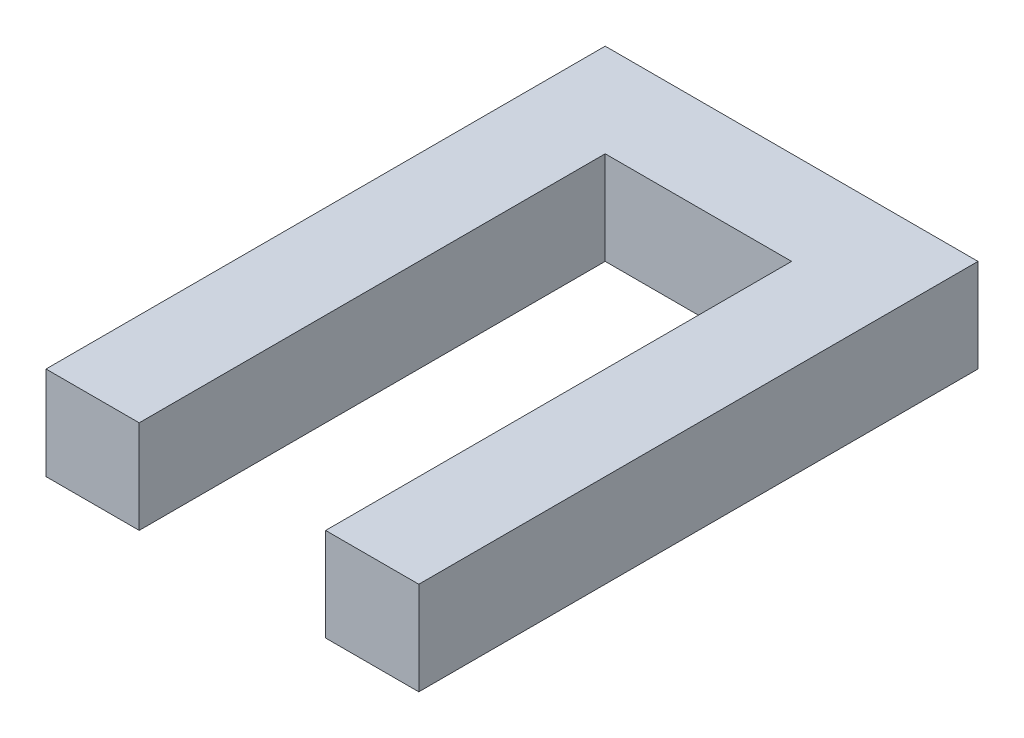
ISO-10303-21;
HEADER;
FILE_DESCRIPTION(('STEP AP214'),'2;1');
FILE_NAME('part.step','',(''),(''),'','','');
FILE_SCHEMA(('AUTOMOTIVE_DESIGN { 1 0 10303 214 1 1 1 1 }'));
ENDSEC;
DATA;
#1=APPLICATION_CONTEXT('core data for automotive mechanical design processes');
#2=APPLICATION_PROTOCOL_DEFINITION('international standard','automotive_design',2000,#1);
#3=PRODUCT_CONTEXT('',#1,'mechanical');
#4=PRODUCT('Part','Part','',(#3));
#5=PRODUCT_RELATED_PRODUCT_CATEGORY('part','',(#4));
#6=PRODUCT_DEFINITION_FORMATION('','',#4);
#7=PRODUCT_DEFINITION_CONTEXT('part definition',#1,'design');
#8=PRODUCT_DEFINITION('design','',#6,#7);
#9=PRODUCT_DEFINITION_SHAPE('','',#8);
#10=(LENGTH_UNIT() NAMED_UNIT(*) SI_UNIT(.MILLI.,.METRE.));
#11=(NAMED_UNIT(*) PLANE_ANGLE_UNIT() SI_UNIT($,.RADIAN.));
#12=(NAMED_UNIT(*) SI_UNIT($,.STERADIAN.) SOLID_ANGLE_UNIT());
#13=UNCERTAINTY_MEASURE_WITH_UNIT(LENGTH_MEASURE(1.E-05),#10,'distance_accuracy_value','');
#14=(GEOMETRIC_REPRESENTATION_CONTEXT(3) GLOBAL_UNCERTAINTY_ASSIGNED_CONTEXT((#13)) GLOBAL_UNIT_ASSIGNED_CONTEXT((#10,
#11,#12)) REPRESENTATION_CONTEXT('',''));
#15=CARTESIAN_POINT('',(0.,0.,0.));
#16=DIRECTION('',(0.,0.,1.));
#17=DIRECTION('',(1.,0.,0.));
#18=AXIS2_PLACEMENT_3D('',#15,#16,#17);
#19=CARTESIAN_POINT('',(-2.00000000000007,2.,-4.));
#20=DIRECTION('',(0.,0.,-1.));
#21=DIRECTION('',(-1.,0.,0.));
#22=AXIS2_PLACEMENT_3D('',#19,#20,#21);
#23=PLANE('',#22);
#24=DIRECTION('',(1.,0.,0.));
#25=VECTOR('',#24,1.);
#26=CARTESIAN_POINT('',(-2.00000000000007,0.,-4.));
#27=LINE('',#26,#25);
#28=CARTESIAN_POINT('',(-2.00000000000007,0.,-4.));
#29=VERTEX_POINT('',#28);
#30=CARTESIAN_POINT('',(2.00000000000007,0.,-4.));
#31=VERTEX_POINT('',#30);
#32=EDGE_CURVE('E133',#29,#31,#27,.T.);
#33=ORIENTED_EDGE('',*,*,#32,.T.);
#34=DIRECTION('',(0.,-1.,0.));
#35=VECTOR('',#34,1.);
#36=CARTESIAN_POINT('',(2.00000000000007,2.,-4.));
#37=LINE('',#36,#35);
#38=CARTESIAN_POINT('',(2.00000000000007,2.,-4.));
#39=VERTEX_POINT('',#38);
#40=EDGE_CURVE('E11',#39,#31,#37,.T.);
#41=ORIENTED_EDGE('',*,*,#40,.F.);
#42=DIRECTION('',(1.,0.,0.));
#43=VECTOR('',#42,1.);
#44=CARTESIAN_POINT('',(-2.00000000000007,2.,-4.));
#45=LINE('',#44,#43);
#46=CARTESIAN_POINT('',(-2.00000000000007,2.,-4.));
#47=VERTEX_POINT('',#46);
#48=EDGE_CURVE('E147',#47,#39,#45,.T.);
#49=ORIENTED_EDGE('',*,*,#48,.F.);
#50=DIRECTION('',(0.,-1.,0.));
#51=VECTOR('',#50,1.);
#52=CARTESIAN_POINT('',(-2.00000000000007,2.,-4.));
#53=LINE('',#52,#51);
#54=EDGE_CURVE('E129',#47,#29,#53,.T.);
#55=ORIENTED_EDGE('',*,*,#54,.T.);
#56=EDGE_LOOP('',(#33,#41,#49,#55));
#57=FACE_BOUND('',#56,.T.);
#58=ADVANCED_FACE('F37',(#57),#23,.F.);
#59=CARTESIAN_POINT('',(2.00000000000007,2.,-4.));
#60=DIRECTION('',(1.,0.,0.));
#61=DIRECTION('',(0.,0.,-1.));
#62=AXIS2_PLACEMENT_3D('',#59,#60,#61);
#63=PLANE('',#62);
#64=DIRECTION('',(0.,0.,1.));
#65=VECTOR('',#64,1.);
#66=CARTESIAN_POINT('',(2.00000000000007,0.,-4.));
#67=LINE('',#66,#65);
#68=CARTESIAN_POINT('',(2.00000000000007,0.,6.00000000000001));
#69=VERTEX_POINT('',#68);
#70=EDGE_CURVE('E136',#31,#69,#67,.T.);
#71=ORIENTED_EDGE('',*,*,#70,.T.);
#72=DIRECTION('',(0.,-1.,0.));
#73=VECTOR('',#72,1.);
#74=CARTESIAN_POINT('',(2.00000000000007,2.,6.00000000000001));
#75=LINE('',#74,#73);
#76=CARTESIAN_POINT('',(2.00000000000007,2.,6.00000000000001));
#77=VERTEX_POINT('',#76);
#78=EDGE_CURVE('E45',#77,#69,#75,.T.);
#79=ORIENTED_EDGE('',*,*,#78,.F.);
#80=DIRECTION('',(0.,0.,1.));
#81=VECTOR('',#80,1.);
#82=CARTESIAN_POINT('',(2.00000000000007,2.,-4.));
#83=LINE('',#82,#81);
#84=EDGE_CURVE('E96',#39,#77,#83,.T.);
#85=ORIENTED_EDGE('',*,*,#84,.F.);
#86=ORIENTED_EDGE('',*,*,#40,.T.);
#87=EDGE_LOOP('',(#71,#79,#85,#86));
#88=FACE_BOUND('',#87,.T.);
#89=ADVANCED_FACE('F182',(#88),#63,.F.);
#90=CARTESIAN_POINT('',(2.00000000000007,2.,6.00000000000001));
#91=DIRECTION('',(0.,0.,-1.));
#92=DIRECTION('',(-1.,0.,0.));
#93=AXIS2_PLACEMENT_3D('',#90,#91,#92);
#94=PLANE('',#93);
#95=DIRECTION('',(1.,0.,0.));
#96=VECTOR('',#95,1.);
#97=CARTESIAN_POINT('',(2.00000000000007,0.,6.00000000000001));
#98=LINE('',#97,#96);
#99=CARTESIAN_POINT('',(4.00000000000007,0.,6.00000000000001));
#100=VERTEX_POINT('',#99);
#101=EDGE_CURVE('E138',#69,#100,#98,.T.);
#102=ORIENTED_EDGE('',*,*,#101,.T.);
#103=DIRECTION('',(0.,-1.,0.));
#104=VECTOR('',#103,1.);
#105=CARTESIAN_POINT('',(4.00000000000007,2.,6.00000000000001));
#106=LINE('',#105,#104);
#107=CARTESIAN_POINT('',(4.00000000000007,2.,6.00000000000001));
#108=VERTEX_POINT('',#107);
#109=EDGE_CURVE('E154',#108,#100,#106,.T.);
#110=ORIENTED_EDGE('',*,*,#109,.F.);
#111=DIRECTION('',(1.,0.,0.));
#112=VECTOR('',#111,1.);
#113=CARTESIAN_POINT('',(2.00000000000007,2.,6.00000000000001));
#114=LINE('',#113,#112);
#115=EDGE_CURVE('E162',#77,#108,#114,.T.);
#116=ORIENTED_EDGE('',*,*,#115,.F.);
#117=ORIENTED_EDGE('',*,*,#78,.T.);
#118=EDGE_LOOP('',(#102,#110,#116,#117));
#119=FACE_BOUND('',#118,.T.);
#120=ADVANCED_FACE('F160',(#119),#94,.F.);
#121=CARTESIAN_POINT('',(4.00000000000007,2.,-6.));
#122=DIRECTION('',(-1.,0.,0.));
#123=DIRECTION('',(0.,0.,1.));
#124=AXIS2_PLACEMENT_3D('',#121,#122,#123);
#125=PLANE('',#124);
#126=DIRECTION('',(0.,0.,-1.));
#127=VECTOR('',#126,1.);
#128=CARTESIAN_POINT('',(4.00000000000007,0.,-6.));
#129=LINE('',#128,#127);
#130=CARTESIAN_POINT('',(4.00000000000007,0.,-6.));
#131=VERTEX_POINT('',#130);
#132=EDGE_CURVE('E140',#100,#131,#129,.T.);
#133=ORIENTED_EDGE('',*,*,#132,.T.);
#134=DIRECTION('',(0.,-1.,0.));
#135=VECTOR('',#134,1.);
#136=CARTESIAN_POINT('',(4.00000000000007,2.,-6.));
#137=LINE('',#136,#135);
#138=CARTESIAN_POINT('',(4.00000000000007,2.,-6.));
#139=VERTEX_POINT('',#138);
#140=EDGE_CURVE('E151',#139,#131,#137,.T.);
#141=ORIENTED_EDGE('',*,*,#140,.F.);
#142=DIRECTION('',(0.,0.,-1.));
#143=VECTOR('',#142,1.);
#144=CARTESIAN_POINT('',(4.00000000000007,2.,-6.));
#145=LINE('',#144,#143);
#146=EDGE_CURVE('E174',#108,#139,#145,.T.);
#147=ORIENTED_EDGE('',*,*,#146,.F.);
#148=ORIENTED_EDGE('',*,*,#109,.T.);
#149=EDGE_LOOP('',(#133,#141,#147,#148));
#150=FACE_BOUND('',#149,.T.);
#151=ADVANCED_FACE('F170',(#150),#125,.F.);
#152=CARTESIAN_POINT('',(-4.00000000000007,2.,-6.));
#153=DIRECTION('',(0.,0.,1.));
#154=DIRECTION('',(1.,0.,0.));
#155=AXIS2_PLACEMENT_3D('',#152,#153,#154);
#156=PLANE('',#155);
#157=DIRECTION('',(-1.,0.,0.));
#158=VECTOR('',#157,1.);
#159=CARTESIAN_POINT('',(-4.00000000000007,0.,-6.));
#160=LINE('',#159,#158);
#161=CARTESIAN_POINT('',(-4.00000000000007,0.,-6.));
#162=VERTEX_POINT('',#161);
#163=EDGE_CURVE('E142',#131,#162,#160,.T.);
#164=ORIENTED_EDGE('',*,*,#163,.T.);
#165=DIRECTION('',(0.,-1.,0.));
#166=VECTOR('',#165,1.);
#167=CARTESIAN_POINT('',(-4.00000000000007,2.,-6.));
#168=LINE('',#167,#166);
#169=CARTESIAN_POINT('',(-4.00000000000007,2.,-6.));
#170=VERTEX_POINT('',#169);
#171=EDGE_CURVE('E124',#170,#162,#168,.T.);
#172=ORIENTED_EDGE('',*,*,#171,.F.);
#173=DIRECTION('',(-1.,0.,0.));
#174=VECTOR('',#173,1.);
#175=CARTESIAN_POINT('',(-4.00000000000007,2.,-6.));
#176=LINE('',#175,#174);
#177=EDGE_CURVE('E115',#139,#170,#176,.T.);
#178=ORIENTED_EDGE('',*,*,#177,.F.);
#179=ORIENTED_EDGE('',*,*,#140,.T.);
#180=EDGE_LOOP('',(#164,#172,#178,#179));
#181=FACE_BOUND('',#180,.T.);
#182=ADVANCED_FACE('F173',(#181),#156,.F.);
#183=CARTESIAN_POINT('',(-4.00000000000007,2.,-6.));
#184=DIRECTION('',(1.,0.,0.));
#185=DIRECTION('',(0.,0.,-1.));
#186=AXIS2_PLACEMENT_3D('',#183,#184,#185);
#187=PLANE('',#186);
#188=DIRECTION('',(0.,0.,1.));
#189=VECTOR('',#188,1.);
#190=CARTESIAN_POINT('',(-4.00000000000007,0.,-6.));
#191=LINE('',#190,#189);
#192=CARTESIAN_POINT('',(-4.00000000000007,0.,6.00000000000001));
#193=VERTEX_POINT('',#192);
#194=EDGE_CURVE('E123',#162,#193,#191,.T.);
#195=ORIENTED_EDGE('',*,*,#194,.T.);
#196=DIRECTION('',(0.,-1.,0.));
#197=VECTOR('',#196,1.);
#198=CARTESIAN_POINT('',(-4.00000000000007,2.,6.00000000000001));
#199=LINE('',#198,#197);
#200=CARTESIAN_POINT('',(-4.00000000000007,2.,6.00000000000001));
#201=VERTEX_POINT('',#200);
#202=EDGE_CURVE('E120',#201,#193,#199,.T.);
#203=ORIENTED_EDGE('',*,*,#202,.F.);
#204=DIRECTION('',(0.,0.,1.));
#205=VECTOR('',#204,1.);
#206=CARTESIAN_POINT('',(-4.00000000000007,2.,-6.));
#207=LINE('',#206,#205);
#208=EDGE_CURVE('E109',#170,#201,#207,.T.);
#209=ORIENTED_EDGE('',*,*,#208,.F.);
#210=ORIENTED_EDGE('',*,*,#171,.T.);
#211=EDGE_LOOP('',(#195,#203,#209,#210));
#212=FACE_BOUND('',#211,.T.);
#213=ADVANCED_FACE('F121',(#212),#187,.F.);
#214=CARTESIAN_POINT('',(-4.00000000000007,2.,6.00000000000001));
#215=DIRECTION('',(0.,0.,-1.));
#216=DIRECTION('',(-1.,0.,0.));
#217=AXIS2_PLACEMENT_3D('',#214,#215,#216);
#218=PLANE('',#217);
#219=DIRECTION('',(1.,0.,0.));
#220=VECTOR('',#219,1.);
#221=CARTESIAN_POINT('',(-4.00000000000007,0.,6.00000000000001));
#222=LINE('',#221,#220);
#223=CARTESIAN_POINT('',(-2.00000000000007,0.,6.00000000000001));
#224=VERTEX_POINT('',#223);
#225=EDGE_CURVE('E82',#193,#224,#222,.T.);
#226=ORIENTED_EDGE('',*,*,#225,.T.);
#227=DIRECTION('',(0.,-1.,0.));
#228=VECTOR('',#227,1.);
#229=CARTESIAN_POINT('',(-2.00000000000007,2.,6.00000000000001));
#230=LINE('',#229,#228);
#231=CARTESIAN_POINT('',(-2.00000000000007,2.,6.00000000000001));
#232=VERTEX_POINT('',#231);
#233=EDGE_CURVE('E125',#232,#224,#230,.T.);
#234=ORIENTED_EDGE('',*,*,#233,.F.);
#235=DIRECTION('',(1.,0.,0.));
#236=VECTOR('',#235,1.);
#237=CARTESIAN_POINT('',(-4.00000000000007,2.,6.00000000000001));
#238=LINE('',#237,#236);
#239=EDGE_CURVE('E113',#201,#232,#238,.T.);
#240=ORIENTED_EDGE('',*,*,#239,.F.);
#241=ORIENTED_EDGE('',*,*,#202,.T.);
#242=EDGE_LOOP('',(#226,#234,#240,#241));
#243=FACE_BOUND('',#242,.T.);
#244=ADVANCED_FACE('F127',(#243),#218,.F.);
#245=CARTESIAN_POINT('',(-2.00000000000007,2.,-4.));
#246=DIRECTION('',(-1.,0.,0.));
#247=DIRECTION('',(0.,0.,1.));
#248=AXIS2_PLACEMENT_3D('',#245,#246,#247);
#249=PLANE('',#248);
#250=DIRECTION('',(0.,0.,-1.));
#251=VECTOR('',#250,1.);
#252=CARTESIAN_POINT('',(-2.00000000000007,0.,-4.));
#253=LINE('',#252,#251);
#254=EDGE_CURVE('E88',#224,#29,#253,.T.);
#255=ORIENTED_EDGE('',*,*,#254,.T.);
#256=ORIENTED_EDGE('',*,*,#54,.F.);
#257=DIRECTION('',(0.,0.,-1.));
#258=VECTOR('',#257,1.);
#259=CARTESIAN_POINT('',(-2.00000000000007,2.,-4.));
#260=LINE('',#259,#258);
#261=EDGE_CURVE('E53',#232,#47,#260,.T.);
#262=ORIENTED_EDGE('',*,*,#261,.F.);
#263=ORIENTED_EDGE('',*,*,#233,.T.);
#264=EDGE_LOOP('',(#255,#256,#262,#263));
#265=FACE_BOUND('',#264,.T.);
#266=ADVANCED_FACE('F198',(#265),#249,.F.);
#267=CARTESIAN_POINT('',(0.,2.,0.));
#268=DIRECTION('',(0.,-1.,0.));
#269=DIRECTION('',(0.,0.,-1.));
#270=AXIS2_PLACEMENT_3D('',#267,#268,#269);
#271=PLANE('',#270);
#272=ORIENTED_EDGE('',*,*,#48,.T.);
#273=ORIENTED_EDGE('',*,*,#84,.T.);
#274=ORIENTED_EDGE('',*,*,#115,.T.);
#275=ORIENTED_EDGE('',*,*,#146,.T.);
#276=ORIENTED_EDGE('',*,*,#177,.T.);
#277=ORIENTED_EDGE('',*,*,#208,.T.);
#278=ORIENTED_EDGE('',*,*,#239,.T.);
#279=ORIENTED_EDGE('',*,*,#261,.T.);
#280=EDGE_LOOP('',(#272,#273,#274,#275,#276,#277,#278,#279));
#281=FACE_BOUND('',#280,.T.);
#282=ADVANCED_FACE('F111',(#281),#271,.F.);
#283=CARTESIAN_POINT('',(0.,0.,0.));
#284=DIRECTION('',(0.,-1.,0.));
#285=DIRECTION('',(0.,0.,-1.));
#286=AXIS2_PLACEMENT_3D('',#283,#284,#285);
#287=PLANE('',#286);
#288=ORIENTED_EDGE('',*,*,#32,.F.);
#289=ORIENTED_EDGE('',*,*,#254,.F.);
#290=ORIENTED_EDGE('',*,*,#225,.F.);
#291=ORIENTED_EDGE('',*,*,#194,.F.);
#292=ORIENTED_EDGE('',*,*,#163,.F.);
#293=ORIENTED_EDGE('',*,*,#132,.F.);
#294=ORIENTED_EDGE('',*,*,#101,.F.);
#295=ORIENTED_EDGE('',*,*,#70,.F.);
#296=EDGE_LOOP('',(#288,#289,#290,#291,#292,#293,#294,#295));
#297=FACE_BOUND('',#296,.T.);
#298=ADVANCED_FACE('F166',(#297),#287,.T.);
#299=CLOSED_SHELL('',(#58,#89,#120,#151,#182,#213,#244,#266,#282,#298));
#300=MANIFOLD_SOLID_BREP('B2',#299);
#301=ADVANCED_BREP_SHAPE_REPRESENTATION('',(#18,#300),#14);
#302=SHAPE_DEFINITION_REPRESENTATION(#9,#301);
ENDSEC;
END-ISO-10303-21;
